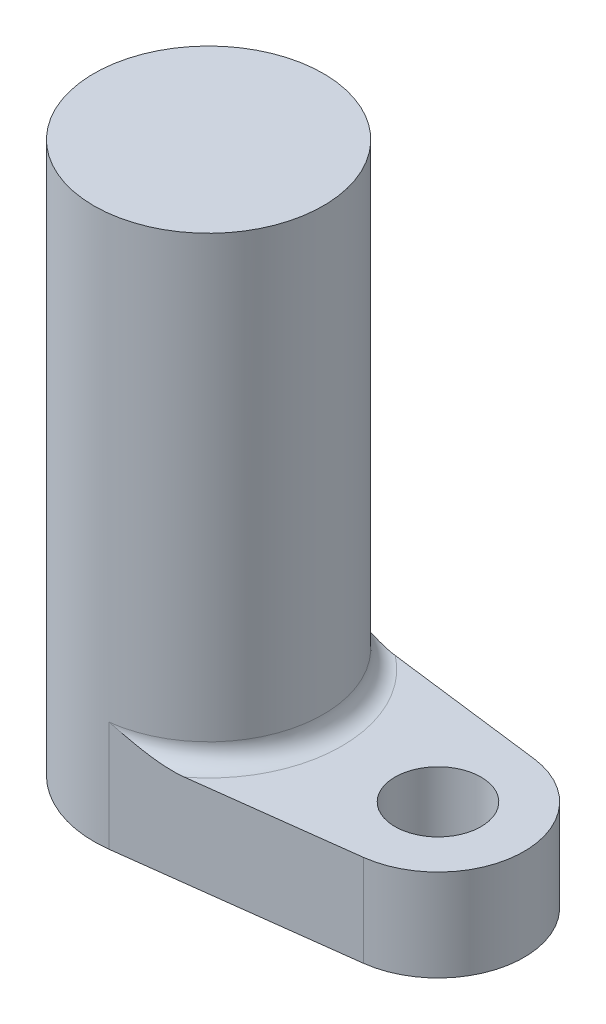
ISO-10303-21;
HEADER;
FILE_DESCRIPTION(('STEP AP214'),'2;1');
FILE_NAME('part.step','',(''),(''),'','','');
FILE_SCHEMA(('AUTOMOTIVE_DESIGN { 1 0 10303 214 1 1 1 1 }'));
ENDSEC;
DATA;
#1=APPLICATION_CONTEXT('core data for automotive mechanical design processes');
#2=APPLICATION_PROTOCOL_DEFINITION('international standard','automotive_design',2000,#1);
#3=PRODUCT_CONTEXT('',#1,'mechanical');
#4=PRODUCT('Part','Part','',(#3));
#5=PRODUCT_RELATED_PRODUCT_CATEGORY('part','',(#4));
#6=PRODUCT_DEFINITION_FORMATION('','',#4);
#7=PRODUCT_DEFINITION_CONTEXT('part definition',#1,'design');
#8=PRODUCT_DEFINITION('design','',#6,#7);
#9=PRODUCT_DEFINITION_SHAPE('','',#8);
#10=(LENGTH_UNIT() NAMED_UNIT(*) SI_UNIT(.MILLI.,.METRE.));
#11=(NAMED_UNIT(*) PLANE_ANGLE_UNIT() SI_UNIT($,.RADIAN.));
#12=(NAMED_UNIT(*) SI_UNIT($,.STERADIAN.) SOLID_ANGLE_UNIT());
#13=UNCERTAINTY_MEASURE_WITH_UNIT(LENGTH_MEASURE(1.E-05),#10,'distance_accuracy_value','');
#14=(GEOMETRIC_REPRESENTATION_CONTEXT(3) GLOBAL_UNCERTAINTY_ASSIGNED_CONTEXT((#13)) GLOBAL_UNIT_ASSIGNED_CONTEXT((#10,
#11,#12)) REPRESENTATION_CONTEXT('',''));
#15=CARTESIAN_POINT('',(0.,0.,0.));
#16=DIRECTION('',(0.,0.,1.));
#17=DIRECTION('',(1.,0.,0.));
#18=AXIS2_PLACEMENT_3D('',#15,#16,#17);
#19=CARTESIAN_POINT('',(0.,12.7,0.));
#20=DIRECTION('',(0.,-1.,0.));
#21=DIRECTION('',(0.,0.,-1.));
#22=AXIS2_PLACEMENT_3D('',#19,#20,#21);
#23=CYLINDRICAL_SURFACE('',#22,3.175);
#24=CARTESIAN_POINT('',(0.,12.7,0.));
#25=DIRECTION('',(0.,1.,0.));
#26=DIRECTION('',(0.,0.,1.));
#27=AXIS2_PLACEMENT_3D('',#24,#25,#26);
#28=CIRCLE('',#27,3.175);
#29=CARTESIAN_POINT('',(0.,12.7,3.175));
#30=VERTEX_POINT('',#29);
#31=EDGE_CURVE('E98',#30,#30,#28,.T.);
#32=ORIENTED_EDGE('',*,*,#31,.F.);
#33=EDGE_LOOP('',(#32));
#34=FACE_BOUND('',#33,.T.);
#35=CARTESIAN_POINT('',(0.,0.508,0.));
#36=DIRECTION('',(0.,-1.,0.));
#37=DIRECTION('',(0.,0.,-1.));
#38=AXIS2_PLACEMENT_3D('',#35,#36,#37);
#39=CIRCLE('',#38,3.175);
#40=CARTESIAN_POINT('',(0.396875,0.508,3.15009765473628));
#41=VERTEX_POINT('',#40);
#42=CARTESIAN_POINT('',(0.396875,0.508,-3.15009765473628));
#43=VERTEX_POINT('',#42);
#44=EDGE_CURVE('E135',#41,#43,#39,.F.);
#45=ORIENTED_EDGE('',*,*,#44,.T.);
#46=DIRECTION('',(0.,1.,0.));
#47=VECTOR('',#46,1.);
#48=CARTESIAN_POINT('',(0.396875,-2.54,-3.15009765473628));
#49=LINE('',#48,#47);
#50=CARTESIAN_POINT('',(0.396875,-2.54,-3.15009765473628));
#51=VERTEX_POINT('',#50);
#52=EDGE_CURVE('E120',#51,#43,#49,.T.);
#53=ORIENTED_EDGE('',*,*,#52,.F.);
#54=CARTESIAN_POINT('',(0.,-2.54,0.));
#55=DIRECTION('',(0.,-1.,0.));
#56=DIRECTION('',(0.,0.,-1.));
#57=AXIS2_PLACEMENT_3D('',#54,#55,#56);
#58=CIRCLE('',#57,3.175);
#59=CARTESIAN_POINT('',(0.396875,-2.54,3.15009765473628));
#60=VERTEX_POINT('',#59);
#61=EDGE_CURVE('E108',#60,#51,#58,.T.);
#62=ORIENTED_EDGE('',*,*,#61,.F.);
#63=DIRECTION('',(0.,1.,0.));
#64=VECTOR('',#63,1.);
#65=CARTESIAN_POINT('',(0.396875,-2.54,3.15009765473628));
#66=LINE('',#65,#64);
#67=EDGE_CURVE('E130',#60,#41,#66,.T.);
#68=ORIENTED_EDGE('',*,*,#67,.T.);
#69=EDGE_LOOP('',(#45,#53,#62,#68));
#70=FACE_BOUND('',#69,.T.);
#71=ADVANCED_FACE('F39',(#34,#70),#23,.T.);
#72=CARTESIAN_POINT('',(0.,12.7,0.));
#73=DIRECTION('',(0.,1.,0.));
#74=DIRECTION('',(0.,0.,1.));
#75=AXIS2_PLACEMENT_3D('',#72,#73,#74);
#76=PLANE('',#75);
#77=ORIENTED_EDGE('',*,*,#31,.T.);
#78=EDGE_LOOP('',(#77));
#79=FACE_BOUND('',#78,.T.);
#80=ADVANCED_FACE('F146',(#79),#76,.T.);
#81=CARTESIAN_POINT('',(0.396875,-2.54,-3.15009765473628));
#82=DIRECTION('',(0.125,0.,-0.992156741649221));
#83=DIRECTION('',(-0.992156741649222,0.,-0.125));
#84=AXIS2_PLACEMENT_3D('',#81,#82,#83);
#85=PLANE('',#84);
#86=DIRECTION('',(-0.992156741649222,0.,-0.125));
#87=VECTOR('',#86,1.);
#88=CARTESIAN_POINT('',(0.396875,0.,-3.15009765473628));
#89=LINE('',#88,#87);
#90=CARTESIAN_POINT('',(6.64765625,0.,-2.36257324105221));
#91=VERTEX_POINT('',#90);
#92=CARTESIAN_POINT('',(2.24874665457004,0.,-2.91678375673618));
#93=VERTEX_POINT('',#92);
#94=EDGE_CURVE('E93',#91,#93,#89,.T.);
#95=ORIENTED_EDGE('',*,*,#94,.F.);
#96=DIRECTION('',(0.,1.,0.));
#97=VECTOR('',#96,1.);
#98=CARTESIAN_POINT('',(6.64765625,-2.54,-2.36257324105221));
#99=LINE('',#98,#97);
#100=CARTESIAN_POINT('',(6.64765625,-2.54,-2.36257324105221));
#101=VERTEX_POINT('',#100);
#102=EDGE_CURVE('E89',#101,#91,#99,.T.);
#103=ORIENTED_EDGE('',*,*,#102,.F.);
#104=DIRECTION('',(-0.992156741649222,0.,-0.125));
#105=VECTOR('',#104,1.);
#106=CARTESIAN_POINT('',(0.396875,-2.54,-3.15009765473628));
#107=LINE('',#106,#105);
#108=EDGE_CURVE('E92',#101,#51,#107,.T.);
#109=ORIENTED_EDGE('',*,*,#108,.T.);
#110=ORIENTED_EDGE('',*,*,#52,.T.);
#111=CARTESIAN_POINT('',(2.24874665457004,0.,-2.91678375673618));
#112=CARTESIAN_POINT('',(2.21231549692085,5.71728721498376E-06,-2.92137365117018));
#113=CARTESIAN_POINT('',(2.1758992098971,0.0010217288468089,-2.92596167208147));
#114=CARTESIAN_POINT('',(2.10317961007519,0.0048511736851646,-2.93512348048952));
#115=CARTESIAN_POINT('',(2.0668762431913,0.00766354336836755,-2.93969727480043));
#116=CARTESIAN_POINT('',(1.95839957562027,0.0184425634130269,-2.95336405029785));
#117=CARTESIAN_POINT('',(1.88645399557374,0.0287536847308182,-2.9624283413804));
#118=CARTESIAN_POINT('',(1.74411958427554,0.0541431163065835,-2.98036079163287));
#119=CARTESIAN_POINT('',(1.67372251439235,0.0691765666242499,-2.9892299887728));
#120=CARTESIAN_POINT('',(1.53378182393322,0.103023101549795,-3.00686085854677));
#121=CARTESIAN_POINT('',(1.46423892542614,0.121839177901396,-3.01562244020869));
#122=CARTESIAN_POINT('',(1.22704733837716,0.191369163494818,-3.04550577127576));
#123=CARTESIAN_POINT('',(1.06148442447233,0.249183267367251,-3.06636473777706));
#124=CARTESIAN_POINT('',(0.733022295383638,0.37256608848623,-3.10774707628523));
#125=CARTESIAN_POINT('',(0.570129927965552,0.438151996715697,-3.1282695855547));
#126=CARTESIAN_POINT('',(0.403795894832265,0.505209760541778,-3.14922570394693));
#127=CARTESIAN_POINT('',(0.400335450392073,0.506604880917865,-3.14966167896667));
#128=CARTESIAN_POINT('',(0.396875,0.508,-3.15009765473628));
#129=B_SPLINE_CURVE_WITH_KNOTS('',3,(#111,#112,#113,#114,#115,#116,#117,#118,#119,#120,#121,
#122,#123,#124,#125,#126,#127,#128),.UNSPECIFIED.,.F.,.F.,(4,2,2,2,2,2,2,2,4),(0.,
0.11012057214495,0.220176003983427,0.439667149666648,0.657133261980577,0.874772053488899,
1.40399836213705,1.93441795718018,1.94568738488306),.UNSPECIFIED.);
#130=EDGE_CURVE('E52',#43,#93,#129,.F.);
#131=ORIENTED_EDGE('',*,*,#130,.T.);
#132=EDGE_LOOP('',(#95,#103,#109,#110,#131));
#133=FACE_BOUND('',#132,.T.);
#134=ADVANCED_FACE('F91',(#133),#85,.T.);
#135=CARTESIAN_POINT('',(6.35,-2.54,0.));
#136=DIRECTION('',(0.,1.,0.));
#137=DIRECTION('',(0.,0.,1.));
#138=AXIS2_PLACEMENT_3D('',#135,#136,#137);
#139=CYLINDRICAL_SURFACE('',#138,2.38125);
#140=CARTESIAN_POINT('',(6.35,0.,0.));
#141=DIRECTION('',(0.,-1.,0.));
#142=DIRECTION('',(0.,0.,-1.));
#143=AXIS2_PLACEMENT_3D('',#140,#141,#142);
#144=CIRCLE('',#143,2.38125);
#145=CARTESIAN_POINT('',(6.64765625,0.,2.36257324105221));
#146=VERTEX_POINT('',#145);
#147=EDGE_CURVE('E125',#146,#91,#144,.F.);
#148=ORIENTED_EDGE('',*,*,#147,.F.);
#149=DIRECTION('',(0.,1.,0.));
#150=VECTOR('',#149,1.);
#151=CARTESIAN_POINT('',(6.64765625,-2.54,2.36257324105221));
#152=LINE('',#151,#150);
#153=CARTESIAN_POINT('',(6.64765625,-2.54,2.36257324105221));
#154=VERTEX_POINT('',#153);
#155=EDGE_CURVE('E99',#154,#146,#152,.T.);
#156=ORIENTED_EDGE('',*,*,#155,.F.);
#157=CARTESIAN_POINT('',(6.35,-2.54,0.));
#158=DIRECTION('',(0.,-1.,0.));
#159=DIRECTION('',(0.,0.,-1.));
#160=AXIS2_PLACEMENT_3D('',#157,#158,#159);
#161=CIRCLE('',#160,2.38125);
#162=EDGE_CURVE('E105',#154,#101,#161,.F.);
#163=ORIENTED_EDGE('',*,*,#162,.T.);
#164=ORIENTED_EDGE('',*,*,#102,.T.);
#165=EDGE_LOOP('',(#148,#156,#163,#164));
#166=FACE_BOUND('',#165,.T.);
#167=ADVANCED_FACE('F112',(#166),#139,.T.);
#168=CARTESIAN_POINT('',(0.396875,-2.54,3.15009765473628));
#169=DIRECTION('',(0.125,0.,0.992156741649221));
#170=DIRECTION('',(0.992156741649222,0.,-0.125));
#171=AXIS2_PLACEMENT_3D('',#168,#169,#170);
#172=PLANE('',#171);
#173=DIRECTION('',(0.992156741649222,0.,-0.125));
#174=VECTOR('',#173,1.);
#175=CARTESIAN_POINT('',(0.396875,0.,3.15009765473628));
#176=LINE('',#175,#174);
#177=CARTESIAN_POINT('',(2.24874665457004,0.,2.91678375673618));
#178=VERTEX_POINT('',#177);
#179=EDGE_CURVE('E127',#178,#146,#176,.T.);
#180=ORIENTED_EDGE('',*,*,#179,.F.);
#181=CARTESIAN_POINT('',(2.24874665457004,0.,2.91678375673618));
#182=CARTESIAN_POINT('',(2.21231549692085,5.71728721472642E-06,2.92137365117018));
#183=CARTESIAN_POINT('',(2.17589920989711,0.00102172884680827,2.92596167208147));
#184=CARTESIAN_POINT('',(2.10317961007522,0.0048511736851627,2.93512348048951));
#185=CARTESIAN_POINT('',(2.06687624319133,0.00766354336836473,2.93969727480042));
#186=CARTESIAN_POINT('',(1.95839957562032,0.0184425634130203,2.95336405029785));
#187=CARTESIAN_POINT('',(1.88645399557381,0.0287536847308077,2.96242834138039));
#188=CARTESIAN_POINT('',(1.7441195842756,0.0541431163065709,2.98036079163286));
#189=CARTESIAN_POINT('',(1.6737225143924,0.0691765666242408,2.98922998877279));
#190=CARTESIAN_POINT('',(1.53378182393324,0.103023101549786,3.00686085854677));
#191=CARTESIAN_POINT('',(1.46423892542614,0.121839177901384,3.01562244020869));
#192=CARTESIAN_POINT('',(1.22704733837716,0.19136916349484,3.04550577127576));
#193=CARTESIAN_POINT('',(1.06148442447237,0.24918326736738,3.06636473777706));
#194=CARTESIAN_POINT('',(0.733022295383581,0.372566088486109,3.10774707628524));
#195=CARTESIAN_POINT('',(0.57012992796536,0.43815199671522,3.12826958555472));
#196=CARTESIAN_POINT('',(0.403795894832259,0.505209760541757,3.14922570394694));
#197=CARTESIAN_POINT('',(0.40033545039207,0.506604880917854,3.14966167896667));
#198=CARTESIAN_POINT('',(0.396875,0.508,3.15009765473628));
#199=B_SPLINE_CURVE_WITH_KNOTS('',3,(#181,#182,#183,#184,#185,#186,#187,#188,#189,#190,#191,
#192,#193,#194,#195,#196,#197,#198),.UNSPECIFIED.,.F.,.F.,(4,2,2,2,2,2,2,2,4),(0.,
0.110120572144929,0.220176003983383,0.439667149666569,0.657133261980542,0.874772053488902,
1.40399836213706,1.93441795718018,1.94568738488306),.UNSPECIFIED.);
#200=EDGE_CURVE('E11',#178,#41,#199,.T.);
#201=ORIENTED_EDGE('',*,*,#200,.T.);
#202=ORIENTED_EDGE('',*,*,#67,.F.);
#203=DIRECTION('',(0.992156741649222,0.,-0.125));
#204=VECTOR('',#203,1.);
#205=CARTESIAN_POINT('',(0.396875,-2.54,3.15009765473628));
#206=LINE('',#205,#204);
#207=EDGE_CURVE('E114',#60,#154,#206,.T.);
#208=ORIENTED_EDGE('',*,*,#207,.T.);
#209=ORIENTED_EDGE('',*,*,#155,.T.);
#210=EDGE_LOOP('',(#180,#201,#202,#208,#209));
#211=FACE_BOUND('',#210,.T.);
#212=ADVANCED_FACE('F150',(#211),#172,.T.);
#213=CARTESIAN_POINT('',(6.35,-2.54,0.));
#214=DIRECTION('',(0.,1.,0.));
#215=DIRECTION('',(0.,0.,1.));
#216=AXIS2_PLACEMENT_3D('',#213,#214,#215);
#217=CYLINDRICAL_SURFACE('',#216,1.190625);
#218=CARTESIAN_POINT('',(6.35,-2.54,0.));
#219=DIRECTION('',(0.,-1.,0.));
#220=DIRECTION('',(0.,0.,-1.));
#221=AXIS2_PLACEMENT_3D('',#218,#219,#220);
#222=CIRCLE('',#221,1.190625);
#223=CARTESIAN_POINT('',(6.35,-2.54,-1.190625));
#224=VERTEX_POINT('',#223);
#225=EDGE_CURVE('E110',#224,#224,#222,.T.);
#226=ORIENTED_EDGE('',*,*,#225,.T.);
#227=EDGE_LOOP('',(#226));
#228=FACE_BOUND('',#227,.T.);
#229=CARTESIAN_POINT('',(6.35,0.,0.));
#230=DIRECTION('',(0.,-1.,0.));
#231=DIRECTION('',(0.,0.,-1.));
#232=AXIS2_PLACEMENT_3D('',#229,#230,#231);
#233=CIRCLE('',#232,1.190625);
#234=CARTESIAN_POINT('',(6.35,0.,-1.190625));
#235=VERTEX_POINT('',#234);
#236=EDGE_CURVE('E121',#235,#235,#233,.T.);
#237=ORIENTED_EDGE('',*,*,#236,.F.);
#238=EDGE_LOOP('',(#237));
#239=FACE_BOUND('',#238,.T.);
#240=ADVANCED_FACE('F147',(#228,#239),#217,.F.);
#241=CARTESIAN_POINT('',(0.,-2.54,0.));
#242=DIRECTION('',(0.,-1.,0.));
#243=DIRECTION('',(0.,0.,-1.));
#244=AXIS2_PLACEMENT_3D('',#241,#242,#243);
#245=PLANE('',#244);
#246=ORIENTED_EDGE('',*,*,#225,.F.);
#247=EDGE_LOOP('',(#246));
#248=FACE_BOUND('',#247,.T.);
#249=ORIENTED_EDGE('',*,*,#108,.F.);
#250=ORIENTED_EDGE('',*,*,#162,.F.);
#251=ORIENTED_EDGE('',*,*,#207,.F.);
#252=ORIENTED_EDGE('',*,*,#61,.T.);
#253=EDGE_LOOP('',(#249,#250,#251,#252));
#254=FACE_BOUND('',#253,.T.);
#255=ADVANCED_FACE('F103',(#248,#254),#245,.T.);
#256=CARTESIAN_POINT('',(0.,0.,0.));
#257=DIRECTION('',(0.,-1.,0.));
#258=DIRECTION('',(0.,0.,-1.));
#259=AXIS2_PLACEMENT_3D('',#256,#257,#258);
#260=PLANE('',#259);
#261=ORIENTED_EDGE('',*,*,#94,.T.);
#262=CARTESIAN_POINT('',(0.,0.,0.));
#263=DIRECTION('',(0.,-1.,0.));
#264=DIRECTION('',(0.,0.,-1.));
#265=AXIS2_PLACEMENT_3D('',#262,#263,#264);
#266=CIRCLE('',#265,3.683);
#267=EDGE_CURVE('E65',#93,#178,#266,.T.);
#268=ORIENTED_EDGE('',*,*,#267,.T.);
#269=ORIENTED_EDGE('',*,*,#179,.T.);
#270=ORIENTED_EDGE('',*,*,#147,.T.);
#271=EDGE_LOOP('',(#261,#268,#269,#270));
#272=FACE_BOUND('',#271,.T.);
#273=ORIENTED_EDGE('',*,*,#236,.T.);
#274=EDGE_LOOP('',(#273));
#275=FACE_BOUND('',#274,.T.);
#276=ADVANCED_FACE('F164',(#272,#275),#260,.F.);
#277=CARTESIAN_POINT('',(0.,0.508,0.));
#278=DIRECTION('',(0.,-1.,0.));
#279=DIRECTION('',(0.,0.,-1.));
#280=AXIS2_PLACEMENT_3D('',#277,#278,#279);
#281=TOROIDAL_SURFACE('',#280,3.683,0.508);
#282=ORIENTED_EDGE('',*,*,#200,.F.);
#283=ORIENTED_EDGE('',*,*,#267,.F.);
#284=ORIENTED_EDGE('',*,*,#130,.F.);
#285=ORIENTED_EDGE('',*,*,#44,.F.);
#286=EDGE_LOOP('',(#282,#283,#284,#285));
#287=FACE_BOUND('',#286,.T.);
#288=ADVANCED_FACE('F41',(#287),#281,.F.);
#289=CLOSED_SHELL('',(#71,#80,#134,#167,#212,#240,#255,#276,#288));
#290=MANIFOLD_SOLID_BREP('B2',#289);
#291=ADVANCED_BREP_SHAPE_REPRESENTATION('',(#18,#290),#14);
#292=SHAPE_DEFINITION_REPRESENTATION(#9,#291);
ENDSEC;
END-ISO-10303-21;
